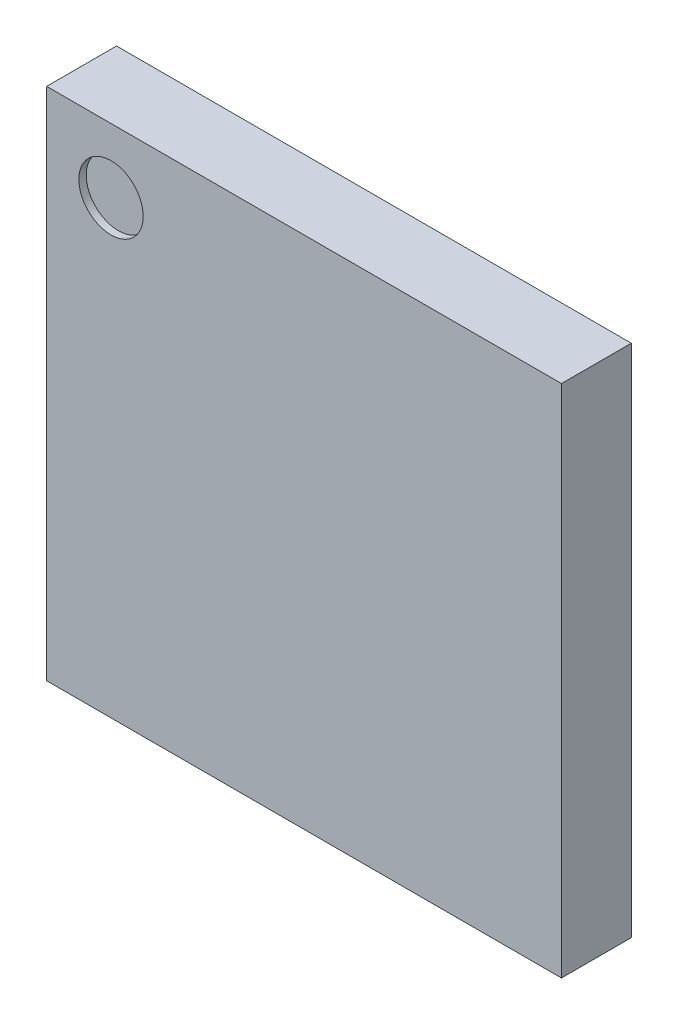
ISO-10303-21;
HEADER;
FILE_DESCRIPTION(('STEP AP214'),'2;1');
FILE_NAME('part.step','',(''),(''),'','','');
FILE_SCHEMA(('AUTOMOTIVE_DESIGN { 1 0 10303 214 1 1 1 1 }'));
ENDSEC;
DATA;
#1=APPLICATION_CONTEXT('core data for automotive mechanical design processes');
#2=APPLICATION_PROTOCOL_DEFINITION('international standard','automotive_design',2000,#1);
#3=PRODUCT_CONTEXT('',#1,'mechanical');
#4=PRODUCT('Part','Part','',(#3));
#5=PRODUCT_RELATED_PRODUCT_CATEGORY('part','',(#4));
#6=PRODUCT_DEFINITION_FORMATION('','',#4);
#7=PRODUCT_DEFINITION_CONTEXT('part definition',#1,'design');
#8=PRODUCT_DEFINITION('design','',#6,#7);
#9=PRODUCT_DEFINITION_SHAPE('','',#8);
#10=(LENGTH_UNIT() NAMED_UNIT(*) SI_UNIT(.MILLI.,.METRE.));
#11=(NAMED_UNIT(*) PLANE_ANGLE_UNIT() SI_UNIT($,.RADIAN.));
#12=(NAMED_UNIT(*) SI_UNIT($,.STERADIAN.) SOLID_ANGLE_UNIT());
#13=UNCERTAINTY_MEASURE_WITH_UNIT(LENGTH_MEASURE(1.E-05),#10,'distance_accuracy_value','');
#14=(GEOMETRIC_REPRESENTATION_CONTEXT(3) GLOBAL_UNCERTAINTY_ASSIGNED_CONTEXT((#13)) GLOBAL_UNIT_ASSIGNED_CONTEXT((#10,
#11,#12)) REPRESENTATION_CONTEXT('',''));
#15=CARTESIAN_POINT('',(0.,0.,0.));
#16=DIRECTION('',(0.,0.,1.));
#17=DIRECTION('',(1.,0.,0.));
#18=AXIS2_PLACEMENT_3D('',#15,#16,#17);
#19=CARTESIAN_POINT('',(-2.625,2.625,0.9));
#20=DIRECTION('',(0.,0.,1.));
#21=DIRECTION('',(1.,0.,0.));
#22=AXIS2_PLACEMENT_3D('',#19,#20,#21);
#23=PLANE('',#22);
#24=CARTESIAN_POINT('',(-2.625,2.625,0.9));
#25=DIRECTION('',(0.,0.,1.));
#26=DIRECTION('',(1.,0.,0.));
#27=AXIS2_PLACEMENT_3D('',#24,#25,#26);
#28=CIRCLE('',#27,0.4375);
#29=CARTESIAN_POINT('',(-2.1875,2.625,0.9));
#30=VERTEX_POINT('',#29);
#31=EDGE_CURVE('E20',#30,#30,#28,.T.);
#32=ORIENTED_EDGE('',*,*,#31,.T.);
#33=EDGE_LOOP('',(#32));
#34=FACE_BOUND('',#33,.T.);
#35=ADVANCED_FACE('F17',(#34),#23,.T.);
#36=CARTESIAN_POINT('',(-2.625,2.625,0.9));
#37=DIRECTION('',(0.,0.,1.));
#38=DIRECTION('',(1.,0.,0.));
#39=AXIS2_PLACEMENT_3D('',#36,#37,#38);
#40=CYLINDRICAL_SURFACE('',#39,0.4375);
#41=CARTESIAN_POINT('',(-2.625,2.625,1.));
#42=DIRECTION('',(0.,0.,1.));
#43=DIRECTION('',(1.,0.,0.));
#44=AXIS2_PLACEMENT_3D('',#41,#42,#43);
#45=CIRCLE('',#44,0.4375);
#46=CARTESIAN_POINT('',(-2.1875,2.625,1.));
#47=VERTEX_POINT('',#46);
#48=EDGE_CURVE('E66',#47,#47,#45,.F.);
#49=ORIENTED_EDGE('',*,*,#48,.F.);
#50=EDGE_LOOP('',(#49));
#51=FACE_BOUND('',#50,.T.);
#52=ORIENTED_EDGE('',*,*,#31,.F.);
#53=EDGE_LOOP('',(#52));
#54=FACE_BOUND('',#53,.T.);
#55=ADVANCED_FACE('F87',(#51,#54),#40,.F.);
#56=CARTESIAN_POINT('',(-3.5,-3.5,1.));
#57=DIRECTION('',(0.,0.,1.));
#58=DIRECTION('',(1.,0.,0.));
#59=AXIS2_PLACEMENT_3D('',#56,#57,#58);
#60=PLANE('',#59);
#61=ORIENTED_EDGE('',*,*,#48,.T.);
#62=EDGE_LOOP('',(#61));
#63=FACE_BOUND('',#62,.T.);
#64=DIRECTION('',(0.,1.,0.));
#65=VECTOR('',#64,1.);
#66=CARTESIAN_POINT('',(3.5,-3.5,1.));
#67=LINE('',#66,#65);
#68=CARTESIAN_POINT('',(3.5,3.5,1.));
#69=VERTEX_POINT('',#68);
#70=CARTESIAN_POINT('',(3.5,-3.5,1.));
#71=VERTEX_POINT('',#70);
#72=EDGE_CURVE('E170',#69,#71,#67,.F.);
#73=ORIENTED_EDGE('',*,*,#72,.F.);
#74=DIRECTION('',(1.,0.,0.));
#75=VECTOR('',#74,1.);
#76=CARTESIAN_POINT('',(-3.5,3.5,1.));
#77=LINE('',#76,#75);
#78=CARTESIAN_POINT('',(-3.5,3.5,1.));
#79=VERTEX_POINT('',#78);
#80=EDGE_CURVE('E60',#79,#69,#77,.T.);
#81=ORIENTED_EDGE('',*,*,#80,.F.);
#82=DIRECTION('',(0.,1.,0.));
#83=VECTOR('',#82,1.);
#84=CARTESIAN_POINT('',(-3.5,-3.5,1.));
#85=LINE('',#84,#83);
#86=CARTESIAN_POINT('',(-3.5,-3.5,1.));
#87=VERTEX_POINT('',#86);
#88=EDGE_CURVE('E58',#79,#87,#85,.F.);
#89=ORIENTED_EDGE('',*,*,#88,.T.);
#90=DIRECTION('',(1.,0.,0.));
#91=VECTOR('',#90,1.);
#92=CARTESIAN_POINT('',(-3.5,-3.5,1.));
#93=LINE('',#92,#91);
#94=EDGE_CURVE('E55',#87,#71,#93,.T.);
#95=ORIENTED_EDGE('',*,*,#94,.T.);
#96=EDGE_LOOP('',(#73,#81,#89,#95));
#97=FACE_BOUND('',#96,.T.);
#98=ADVANCED_FACE('F59',(#63,#97),#60,.T.);
#99=CARTESIAN_POINT('',(-3.5,-3.5,0.05));
#100=DIRECTION('',(1.,0.,0.));
#101=DIRECTION('',(0.,0.,-1.));
#102=AXIS2_PLACEMENT_3D('',#99,#100,#101);
#103=PLANE('',#102);
#104=DIRECTION('',(0.,0.,1.));
#105=VECTOR('',#104,1.);
#106=CARTESIAN_POINT('',(-3.5,3.5,0.05));
#107=LINE('',#106,#105);
#108=CARTESIAN_POINT('',(-3.5,3.5,0.05));
#109=VERTEX_POINT('',#108);
#110=EDGE_CURVE('E174',#109,#79,#107,.T.);
#111=ORIENTED_EDGE('',*,*,#110,.F.);
#112=DIRECTION('',(0.,1.,0.));
#113=VECTOR('',#112,1.);
#114=CARTESIAN_POINT('',(-3.5,-3.5,0.05));
#115=LINE('',#114,#113);
#116=CARTESIAN_POINT('',(-3.5,-3.5,0.05));
#117=VERTEX_POINT('',#116);
#118=EDGE_CURVE('E77',#109,#117,#115,.F.);
#119=ORIENTED_EDGE('',*,*,#118,.T.);
#120=DIRECTION('',(0.,0.,1.));
#121=VECTOR('',#120,1.);
#122=CARTESIAN_POINT('',(-3.5,-3.5,0.05));
#123=LINE('',#122,#121);
#124=EDGE_CURVE('E65',#117,#87,#123,.T.);
#125=ORIENTED_EDGE('',*,*,#124,.T.);
#126=ORIENTED_EDGE('',*,*,#88,.F.);
#127=EDGE_LOOP('',(#111,#119,#125,#126));
#128=FACE_BOUND('',#127,.T.);
#129=ADVANCED_FACE('F76',(#128),#103,.F.);
#130=CARTESIAN_POINT('',(-3.5,-3.5,0.05));
#131=DIRECTION('',(0.,1.,0.));
#132=DIRECTION('',(0.,0.,1.));
#133=AXIS2_PLACEMENT_3D('',#130,#131,#132);
#134=PLANE('',#133);
#135=ORIENTED_EDGE('',*,*,#94,.F.);
#136=ORIENTED_EDGE('',*,*,#124,.F.);
#137=DIRECTION('',(1.,0.,0.));
#138=VECTOR('',#137,1.);
#139=CARTESIAN_POINT('',(-3.5,-3.5,0.05));
#140=LINE('',#139,#138);
#141=CARTESIAN_POINT('',(3.5,-3.5,0.05));
#142=VERTEX_POINT('',#141);
#143=EDGE_CURVE('E172',#117,#142,#140,.T.);
#144=ORIENTED_EDGE('',*,*,#143,.T.);
#145=DIRECTION('',(0.,0.,-1.));
#146=VECTOR('',#145,1.);
#147=CARTESIAN_POINT('',(3.5,-3.5,0.05));
#148=LINE('',#147,#146);
#149=EDGE_CURVE('E73',#71,#142,#148,.T.);
#150=ORIENTED_EDGE('',*,*,#149,.F.);
#151=EDGE_LOOP('',(#135,#136,#144,#150));
#152=FACE_BOUND('',#151,.T.);
#153=ADVANCED_FACE('F70',(#152),#134,.F.);
#154=CARTESIAN_POINT('',(3.5,-3.5,0.05));
#155=DIRECTION('',(1.,0.,0.));
#156=DIRECTION('',(0.,0.,-1.));
#157=AXIS2_PLACEMENT_3D('',#154,#155,#156);
#158=PLANE('',#157);
#159=DIRECTION('',(0.,0.,1.));
#160=VECTOR('',#159,1.);
#161=CARTESIAN_POINT('',(3.5,3.5,0.05));
#162=LINE('',#161,#160);
#163=CARTESIAN_POINT('',(3.5,3.5,0.05));
#164=VERTEX_POINT('',#163);
#165=EDGE_CURVE('E34',#69,#164,#162,.F.);
#166=ORIENTED_EDGE('',*,*,#165,.F.);
#167=ORIENTED_EDGE('',*,*,#72,.T.);
#168=ORIENTED_EDGE('',*,*,#149,.T.);
#169=DIRECTION('',(0.,1.,0.));
#170=VECTOR('',#169,1.);
#171=CARTESIAN_POINT('',(3.5,-3.5,0.05));
#172=LINE('',#171,#170);
#173=EDGE_CURVE('E26',#142,#164,#172,.T.);
#174=ORIENTED_EDGE('',*,*,#173,.T.);
#175=EDGE_LOOP('',(#166,#167,#168,#174));
#176=FACE_BOUND('',#175,.T.);
#177=ADVANCED_FACE('F104',(#176),#158,.T.);
#178=CARTESIAN_POINT('',(-3.5,3.5,0.05));
#179=DIRECTION('',(0.,1.,0.));
#180=DIRECTION('',(0.,0.,1.));
#181=AXIS2_PLACEMENT_3D('',#178,#179,#180);
#182=PLANE('',#181);
#183=ORIENTED_EDGE('',*,*,#80,.T.);
#184=ORIENTED_EDGE('',*,*,#165,.T.);
#185=DIRECTION('',(1.,0.,0.));
#186=VECTOR('',#185,1.);
#187=CARTESIAN_POINT('',(-3.5,3.5,0.05));
#188=LINE('',#187,#186);
#189=EDGE_CURVE('E11',#164,#109,#188,.F.);
#190=ORIENTED_EDGE('',*,*,#189,.T.);
#191=ORIENTED_EDGE('',*,*,#110,.T.);
#192=EDGE_LOOP('',(#183,#184,#190,#191));
#193=FACE_BOUND('',#192,.T.);
#194=ADVANCED_FACE('F98',(#193),#182,.T.);
#195=CARTESIAN_POINT('',(-3.5,-3.5,0.05));
#196=DIRECTION('',(0.,0.,1.));
#197=DIRECTION('',(1.,0.,0.));
#198=AXIS2_PLACEMENT_3D('',#195,#196,#197);
#199=PLANE('',#198);
#200=ORIENTED_EDGE('',*,*,#173,.F.);
#201=ORIENTED_EDGE('',*,*,#143,.F.);
#202=ORIENTED_EDGE('',*,*,#118,.F.);
#203=ORIENTED_EDGE('',*,*,#189,.F.);
#204=EDGE_LOOP('',(#200,#201,#202,#203));
#205=FACE_BOUND('',#204,.T.);
#206=ADVANCED_FACE('F96',(#205),#199,.F.);
#207=CLOSED_SHELL('',(#35,#55,#98,#129,#153,#177,#194,#206));
#208=MANIFOLD_SOLID_BREP('B1',#207);
#209=ADVANCED_BREP_SHAPE_REPRESENTATION('',(#18,#208),#14);
#210=SHAPE_DEFINITION_REPRESENTATION(#9,#209);
ENDSEC;
END-ISO-10303-21;
